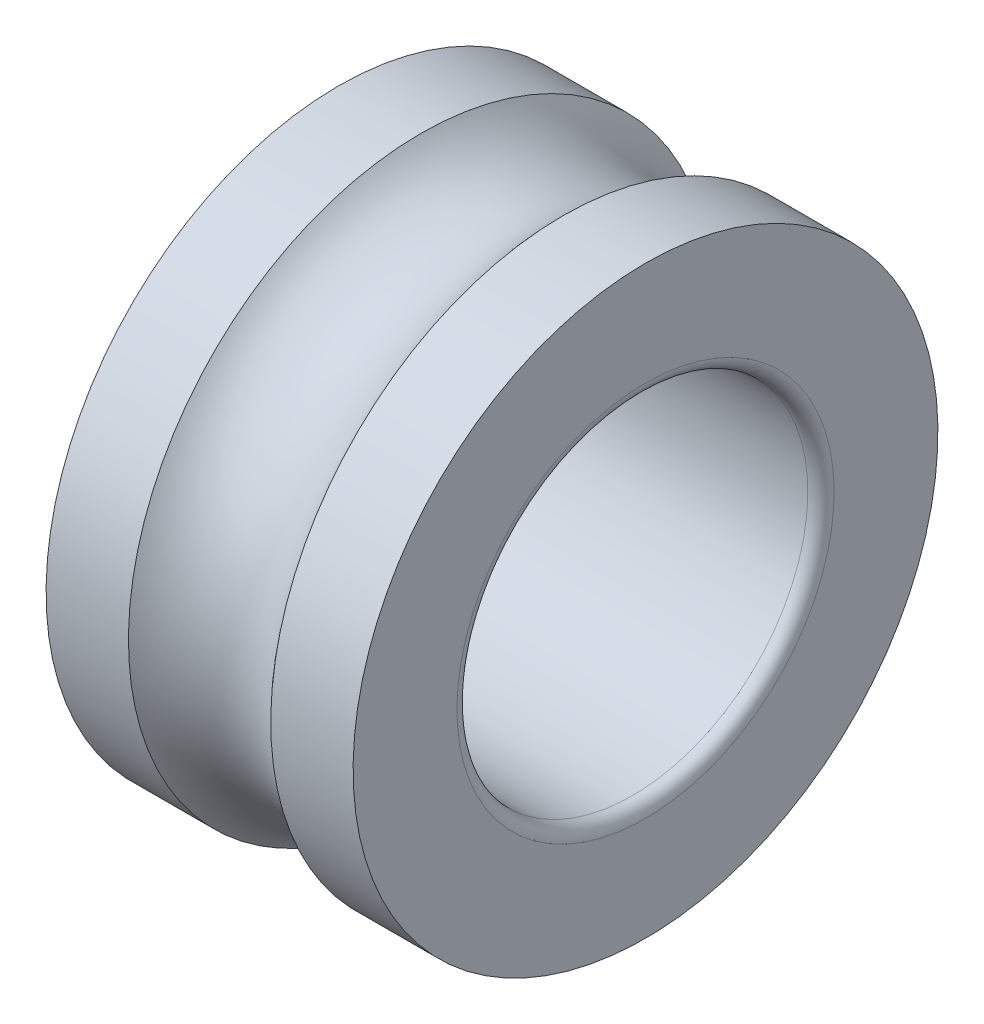
ISO-10303-21;
HEADER;
FILE_DESCRIPTION(('STEP AP214'),'2;1');
FILE_NAME('part.step','',(''),(''),'','','');
FILE_SCHEMA(('AUTOMOTIVE_DESIGN { 1 0 10303 214 1 1 1 1 }'));
ENDSEC;
DATA;
#1=APPLICATION_CONTEXT('core data for automotive mechanical design processes');
#2=APPLICATION_PROTOCOL_DEFINITION('international standard','automotive_design',2000,#1);
#3=PRODUCT_CONTEXT('',#1,'mechanical');
#4=PRODUCT('Part','Part','',(#3));
#5=PRODUCT_RELATED_PRODUCT_CATEGORY('part','',(#4));
#6=PRODUCT_DEFINITION_FORMATION('','',#4);
#7=PRODUCT_DEFINITION_CONTEXT('part definition',#1,'design');
#8=PRODUCT_DEFINITION('design','',#6,#7);
#9=PRODUCT_DEFINITION_SHAPE('','',#8);
#10=(LENGTH_UNIT() NAMED_UNIT(*) SI_UNIT(.MILLI.,.METRE.));
#11=(NAMED_UNIT(*) PLANE_ANGLE_UNIT() SI_UNIT($,.RADIAN.));
#12=(NAMED_UNIT(*) SI_UNIT($,.STERADIAN.) SOLID_ANGLE_UNIT());
#13=UNCERTAINTY_MEASURE_WITH_UNIT(LENGTH_MEASURE(1.E-05),#10,'distance_accuracy_value','');
#14=(GEOMETRIC_REPRESENTATION_CONTEXT(3) GLOBAL_UNCERTAINTY_ASSIGNED_CONTEXT((#13)) GLOBAL_UNIT_ASSIGNED_CONTEXT((#10,
#11,#12)) REPRESENTATION_CONTEXT('',''));
#15=CARTESIAN_POINT('',(0.,0.,0.));
#16=DIRECTION('',(0.,0.,1.));
#17=DIRECTION('',(1.,0.,0.));
#18=AXIS2_PLACEMENT_3D('',#15,#16,#17);
#19=CARTESIAN_POINT('',(-2.5612062349092,0.,0.));
#20=DIRECTION('',(-1.,0.,0.));
#21=DIRECTION('',(0.,1.,0.));
#22=AXIS2_PLACEMENT_3D('',#19,#20,#21);
#23=CYLINDRICAL_SURFACE('',#22,6.66666666666667);
#24=CARTESIAN_POINT('',(-3.5,0.,0.));
#25=DIRECTION('',(1.,0.,0.));
#26=DIRECTION('',(0.,1.,0.));
#27=AXIS2_PLACEMENT_3D('',#24,#25,#26);
#28=CIRCLE('',#27,6.66666666666667);
#29=CARTESIAN_POINT('',(-3.5,6.66666666666667,0.));
#30=VERTEX_POINT('',#29);
#31=EDGE_CURVE('E11',#30,#30,#28,.T.);
#32=ORIENTED_EDGE('',*,*,#31,.T.);
#33=EDGE_LOOP('',(#32));
#34=FACE_BOUND('',#33,.T.);
#35=CARTESIAN_POINT('',(-1.6224124698184,0.,0.));
#36=DIRECTION('',(1.,0.,0.));
#37=DIRECTION('',(0.,1.,0.));
#38=AXIS2_PLACEMENT_3D('',#35,#36,#37);
#39=CIRCLE('',#38,6.66666666666667);
#40=CARTESIAN_POINT('',(-1.6224124698184,6.66666666666667,0.));
#41=VERTEX_POINT('',#40);
#42=EDGE_CURVE('E55',#41,#41,#39,.T.);
#43=ORIENTED_EDGE('',*,*,#42,.F.);
#44=EDGE_LOOP('',(#43));
#45=FACE_BOUND('',#44,.T.);
#46=ADVANCED_FACE('F16',(#34,#45),#23,.T.);
#47=CARTESIAN_POINT('',(-3.5,5.48333333333333,0.));
#48=DIRECTION('',(-1.,0.,0.));
#49=DIRECTION('',(0.,-1.,0.));
#50=AXIS2_PLACEMENT_3D('',#47,#48,#49);
#51=PLANE('',#50);
#52=CARTESIAN_POINT('',(-3.5,0.,0.));
#53=DIRECTION('',(1.,0.,0.));
#54=DIRECTION('',(0.,1.,0.));
#55=AXIS2_PLACEMENT_3D('',#52,#53,#54);
#56=CIRCLE('',#55,4.3);
#57=CARTESIAN_POINT('',(-3.5,4.3,0.));
#58=VERTEX_POINT('',#57);
#59=EDGE_CURVE('E26',#58,#58,#56,.T.);
#60=ORIENTED_EDGE('',*,*,#59,.T.);
#61=EDGE_LOOP('',(#60));
#62=FACE_BOUND('',#61,.T.);
#63=ORIENTED_EDGE('',*,*,#31,.F.);
#64=EDGE_LOOP('',(#63));
#65=FACE_BOUND('',#64,.T.);
#66=ADVANCED_FACE('F84',(#62,#65),#51,.T.);
#67=CARTESIAN_POINT('',(-3.2,0.,0.));
#68=DIRECTION('',(1.,0.,0.));
#69=DIRECTION('',(0.,0.,-1.));
#70=AXIS2_PLACEMENT_3D('',#67,#68,#69);
#71=TOROIDAL_SURFACE('',#70,4.3,0.3);
#72=CARTESIAN_POINT('',(-3.2,0.,0.));
#73=DIRECTION('',(1.,0.,0.));
#74=DIRECTION('',(0.,1.,0.));
#75=AXIS2_PLACEMENT_3D('',#72,#73,#74);
#76=CIRCLE('',#75,4.);
#77=CARTESIAN_POINT('',(-3.2,4.,0.));
#78=VERTEX_POINT('',#77);
#79=EDGE_CURVE('E42',#78,#78,#76,.T.);
#80=ORIENTED_EDGE('',*,*,#79,.T.);
#81=EDGE_LOOP('',(#80));
#82=FACE_BOUND('',#81,.T.);
#83=ORIENTED_EDGE('',*,*,#59,.F.);
#84=EDGE_LOOP('',(#83));
#85=FACE_BOUND('',#84,.T.);
#86=ADVANCED_FACE('F88',(#82,#85),#71,.T.);
#87=CARTESIAN_POINT('',(0.,0.,0.));
#88=DIRECTION('',(-1.,0.,0.));
#89=DIRECTION('',(0.,1.,0.));
#90=AXIS2_PLACEMENT_3D('',#87,#88,#89);
#91=CYLINDRICAL_SURFACE('',#90,4.);
#92=CARTESIAN_POINT('',(3.2,0.,0.));
#93=DIRECTION('',(1.,0.,0.));
#94=DIRECTION('',(0.,1.,0.));
#95=AXIS2_PLACEMENT_3D('',#92,#93,#94);
#96=CIRCLE('',#95,4.);
#97=CARTESIAN_POINT('',(3.2,4.,0.));
#98=VERTEX_POINT('',#97);
#99=EDGE_CURVE('E20',#98,#98,#96,.T.);
#100=ORIENTED_EDGE('',*,*,#99,.T.);
#101=EDGE_LOOP('',(#100));
#102=FACE_BOUND('',#101,.T.);
#103=ORIENTED_EDGE('',*,*,#79,.F.);
#104=EDGE_LOOP('',(#103));
#105=FACE_BOUND('',#104,.T.);
#106=ADVANCED_FACE('F18',(#102,#105),#91,.F.);
#107=CARTESIAN_POINT('',(3.2,0.,0.));
#108=DIRECTION('',(1.,0.,0.));
#109=DIRECTION('',(0.,0.,-1.));
#110=AXIS2_PLACEMENT_3D('',#107,#108,#109);
#111=TOROIDAL_SURFACE('',#110,4.3,0.3);
#112=CARTESIAN_POINT('',(3.5,0.,0.));
#113=DIRECTION('',(1.,0.,0.));
#114=DIRECTION('',(0.,1.,0.));
#115=AXIS2_PLACEMENT_3D('',#112,#113,#114);
#116=CIRCLE('',#115,4.3);
#117=CARTESIAN_POINT('',(3.5,4.3,0.));
#118=VERTEX_POINT('',#117);
#119=EDGE_CURVE('E63',#118,#118,#116,.T.);
#120=ORIENTED_EDGE('',*,*,#119,.T.);
#121=EDGE_LOOP('',(#120));
#122=FACE_BOUND('',#121,.T.);
#123=ORIENTED_EDGE('',*,*,#99,.F.);
#124=EDGE_LOOP('',(#123));
#125=FACE_BOUND('',#124,.T.);
#126=ADVANCED_FACE('F95',(#122,#125),#111,.T.);
#127=CARTESIAN_POINT('',(3.5,5.48333333333333,0.));
#128=DIRECTION('',(1.,0.,0.));
#129=DIRECTION('',(0.,1.,0.));
#130=AXIS2_PLACEMENT_3D('',#127,#128,#129);
#131=PLANE('',#130);
#132=CARTESIAN_POINT('',(3.5,0.,0.));
#133=DIRECTION('',(1.,0.,0.));
#134=DIRECTION('',(0.,1.,0.));
#135=AXIS2_PLACEMENT_3D('',#132,#133,#134);
#136=CIRCLE('',#135,6.66666666666667);
#137=CARTESIAN_POINT('',(3.5,6.66666666666667,0.));
#138=VERTEX_POINT('',#137);
#139=EDGE_CURVE('E59',#138,#138,#136,.T.);
#140=ORIENTED_EDGE('',*,*,#139,.T.);
#141=EDGE_LOOP('',(#140));
#142=FACE_BOUND('',#141,.T.);
#143=ORIENTED_EDGE('',*,*,#119,.F.);
#144=EDGE_LOOP('',(#143));
#145=FACE_BOUND('',#144,.T.);
#146=ADVANCED_FACE('F60',(#142,#145),#131,.T.);
#147=CARTESIAN_POINT('',(2.5612062349092,0.,0.));
#148=DIRECTION('',(-1.,0.,0.));
#149=DIRECTION('',(0.,1.,0.));
#150=AXIS2_PLACEMENT_3D('',#147,#148,#149);
#151=CYLINDRICAL_SURFACE('',#150,6.66666666666667);
#152=CARTESIAN_POINT('',(1.6224124698184,0.,0.));
#153=DIRECTION('',(1.,0.,0.));
#154=DIRECTION('',(0.,1.,0.));
#155=AXIS2_PLACEMENT_3D('',#152,#153,#154);
#156=CIRCLE('',#155,6.66666666666667);
#157=CARTESIAN_POINT('',(1.6224124698184,6.66666666666667,0.));
#158=VERTEX_POINT('',#157);
#159=EDGE_CURVE('E65',#158,#158,#156,.T.);
#160=ORIENTED_EDGE('',*,*,#159,.T.);
#161=EDGE_LOOP('',(#160));
#162=FACE_BOUND('',#161,.T.);
#163=ORIENTED_EDGE('',*,*,#139,.F.);
#164=EDGE_LOOP('',(#163));
#165=FACE_BOUND('',#164,.T.);
#166=ADVANCED_FACE('F72',(#162,#165),#151,.T.);
#167=CARTESIAN_POINT('',(0.,0.,0.));
#168=DIRECTION('',(1.,0.,0.));
#169=DIRECTION('',(0.,0.,-1.));
#170=AXIS2_PLACEMENT_3D('',#167,#168,#169);
#171=TOROIDAL_SURFACE('',#170,8.,2.1);
#172=ORIENTED_EDGE('',*,*,#42,.T.);
#173=EDGE_LOOP('',(#172));
#174=FACE_BOUND('',#173,.T.);
#175=ORIENTED_EDGE('',*,*,#159,.F.);
#176=EDGE_LOOP('',(#175));
#177=FACE_BOUND('',#176,.T.);
#178=ADVANCED_FACE('F74',(#174,#177),#171,.F.);
#179=CLOSED_SHELL('',(#46,#66,#86,#106,#126,#146,#166,#178));
#180=MANIFOLD_SOLID_BREP('B1',#179);
#181=ADVANCED_BREP_SHAPE_REPRESENTATION('',(#18,#180),#14);
#182=SHAPE_DEFINITION_REPRESENTATION(#9,#181);
ENDSEC;
END-ISO-10303-21;
